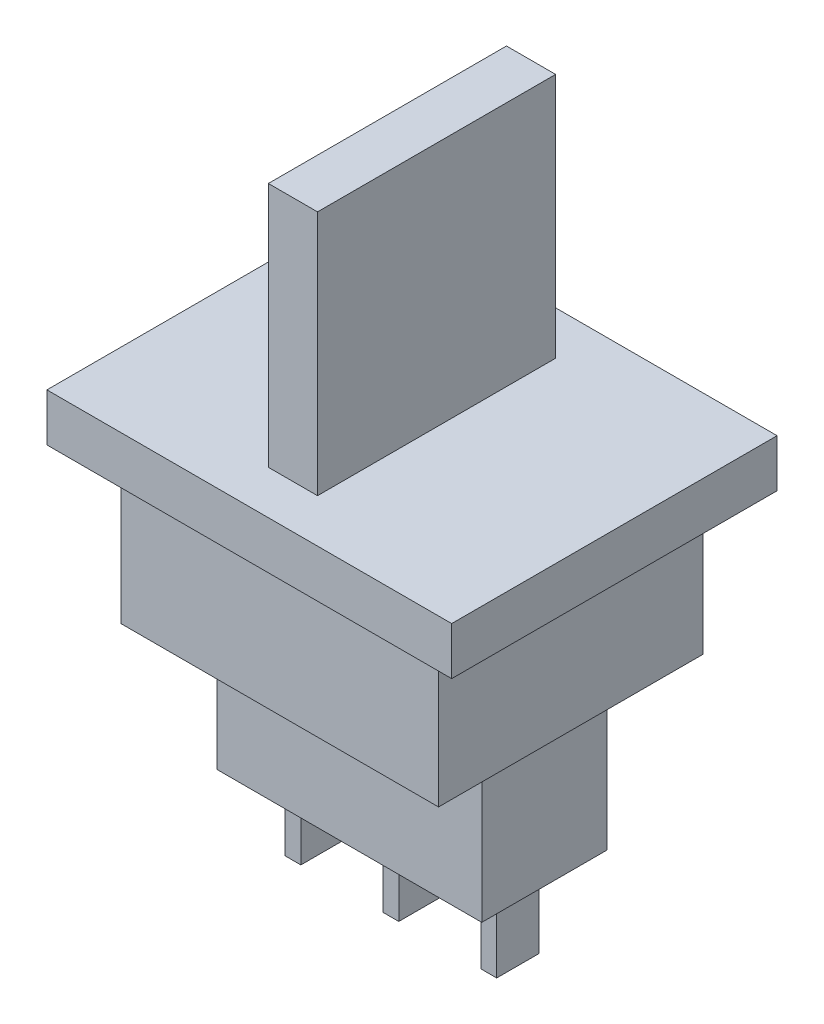
ISO-10303-21;
HEADER;
FILE_DESCRIPTION(('STEP AP214'),'2;1');
FILE_NAME('part.step','',(''),(''),'','','');
FILE_SCHEMA(('AUTOMOTIVE_DESIGN { 1 0 10303 214 1 1 1 1 }'));
ENDSEC;
DATA;
#1=APPLICATION_CONTEXT('core data for automotive mechanical design processes');
#2=APPLICATION_PROTOCOL_DEFINITION('international standard','automotive_design',2000,#1);
#3=PRODUCT_CONTEXT('',#1,'mechanical');
#4=PRODUCT('Part','Part','',(#3));
#5=PRODUCT_RELATED_PRODUCT_CATEGORY('part','',(#4));
#6=PRODUCT_DEFINITION_FORMATION('','',#4);
#7=PRODUCT_DEFINITION_CONTEXT('part definition',#1,'design');
#8=PRODUCT_DEFINITION('design','',#6,#7);
#9=PRODUCT_DEFINITION_SHAPE('','',#8);
#10=(LENGTH_UNIT() NAMED_UNIT(*) SI_UNIT(.MILLI.,.METRE.));
#11=(NAMED_UNIT(*) PLANE_ANGLE_UNIT() SI_UNIT($,.RADIAN.));
#12=(NAMED_UNIT(*) SI_UNIT($,.STERADIAN.) SOLID_ANGLE_UNIT());
#13=UNCERTAINTY_MEASURE_WITH_UNIT(LENGTH_MEASURE(1.E-05),#10,'distance_accuracy_value','');
#14=(GEOMETRIC_REPRESENTATION_CONTEXT(3) GLOBAL_UNCERTAINTY_ASSIGNED_CONTEXT((#13)) GLOBAL_UNIT_ASSIGNED_CONTEXT((#10,
#11,#12)) REPRESENTATION_CONTEXT('',''));
#15=CARTESIAN_POINT('',(0.,0.,0.));
#16=DIRECTION('',(0.,0.,1.));
#17=DIRECTION('',(1.,0.,0.));
#18=AXIS2_PLACEMENT_3D('',#15,#16,#17);
#19=CARTESIAN_POINT('',(0.,-14.22,0.));
#20=DIRECTION('',(0.,-1.,0.));
#21=DIRECTION('',(0.,0.,-1.));
#22=AXIS2_PLACEMENT_3D('',#19,#20,#21);
#23=PLANE('',#22);
#24=DIRECTION('',(0.,0.,1.));
#25=VECTOR('',#24,1.);
#26=CARTESIAN_POINT('',(6.35,-14.22,3.));
#27=LINE('',#26,#25);
#28=CARTESIAN_POINT('',(6.35,-14.22,-3.));
#29=VERTEX_POINT('',#28);
#30=CARTESIAN_POINT('',(6.35,-14.22,3.));
#31=VERTEX_POINT('',#30);
#32=EDGE_CURVE('E334',#29,#31,#27,.T.);
#33=ORIENTED_EDGE('',*,*,#32,.T.);
#34=DIRECTION('',(-1.,0.,0.));
#35=VECTOR('',#34,1.);
#36=CARTESIAN_POINT('',(-6.35,-14.22,3.));
#37=LINE('',#36,#35);
#38=CARTESIAN_POINT('',(-6.35,-14.22,3.));
#39=VERTEX_POINT('',#38);
#40=EDGE_CURVE('E337',#31,#39,#37,.T.);
#41=ORIENTED_EDGE('',*,*,#40,.T.);
#42=DIRECTION('',(0.,0.,-1.));
#43=VECTOR('',#42,1.);
#44=CARTESIAN_POINT('',(-6.35,-14.22,3.));
#45=LINE('',#44,#43);
#46=CARTESIAN_POINT('',(-6.35,-14.22,-3.));
#47=VERTEX_POINT('',#46);
#48=EDGE_CURVE('E340',#39,#47,#45,.T.);
#49=ORIENTED_EDGE('',*,*,#48,.T.);
#50=DIRECTION('',(1.,0.,0.));
#51=VECTOR('',#50,1.);
#52=CARTESIAN_POINT('',(-6.35,-14.22,-3.));
#53=LINE('',#52,#51);
#54=EDGE_CURVE('E342',#47,#29,#53,.T.);
#55=ORIENTED_EDGE('',*,*,#54,.T.);
#56=EDGE_LOOP('',(#33,#41,#49,#55));
#57=FACE_BOUND('',#56,.T.);
#58=DIRECTION('',(-1.,0.,0.));
#59=VECTOR('',#58,1.);
#60=CARTESIAN_POINT('',(-5.08,-14.22,1.015));
#61=LINE('',#60,#59);
#62=CARTESIAN_POINT('',(-4.32,-14.22,1.015));
#63=VERTEX_POINT('',#62);
#64=CARTESIAN_POINT('',(-5.08,-14.22,1.015));
#65=VERTEX_POINT('',#64);
#66=EDGE_CURVE('E318',#63,#65,#61,.T.);
#67=ORIENTED_EDGE('',*,*,#66,.F.);
#68=DIRECTION('',(0.,0.,1.));
#69=VECTOR('',#68,1.);
#70=CARTESIAN_POINT('',(-4.32,-14.22,1.015));
#71=LINE('',#70,#69);
#72=CARTESIAN_POINT('',(-4.32,-14.22,-1.015));
#73=VERTEX_POINT('',#72);
#74=EDGE_CURVE('E304',#73,#63,#71,.T.);
#75=ORIENTED_EDGE('',*,*,#74,.F.);
#76=DIRECTION('',(1.,0.,0.));
#77=VECTOR('',#76,1.);
#78=CARTESIAN_POINT('',(-5.08,-14.22,-1.015));
#79=LINE('',#78,#77);
#80=CARTESIAN_POINT('',(-5.08,-14.22,-1.015));
#81=VERTEX_POINT('',#80);
#82=EDGE_CURVE('E309',#81,#73,#79,.T.);
#83=ORIENTED_EDGE('',*,*,#82,.F.);
#84=DIRECTION('',(0.,0.,-1.));
#85=VECTOR('',#84,1.);
#86=CARTESIAN_POINT('',(-5.08,-14.22,1.015));
#87=LINE('',#86,#85);
#88=EDGE_CURVE('E320',#65,#81,#87,.T.);
#89=ORIENTED_EDGE('',*,*,#88,.F.);
#90=EDGE_LOOP('',(#67,#75,#83,#89));
#91=FACE_BOUND('',#90,.T.);
#92=DIRECTION('',(0.,0.,1.));
#93=VECTOR('',#92,1.);
#94=CARTESIAN_POINT('',(0.38,-14.22,1.015));
#95=LINE('',#94,#93);
#96=CARTESIAN_POINT('',(0.38,-14.22,-1.015));
#97=VERTEX_POINT('',#96);
#98=CARTESIAN_POINT('',(0.38,-14.22,1.015));
#99=VERTEX_POINT('',#98);
#100=EDGE_CURVE('E289',#97,#99,#95,.T.);
#101=ORIENTED_EDGE('',*,*,#100,.F.);
#102=DIRECTION('',(1.,0.,0.));
#103=VECTOR('',#102,1.);
#104=CARTESIAN_POINT('',(-0.38,-14.22,-1.015));
#105=LINE('',#104,#103);
#106=CARTESIAN_POINT('',(-0.38,-14.22,-1.015));
#107=VERTEX_POINT('',#106);
#108=EDGE_CURVE('E275',#107,#97,#105,.T.);
#109=ORIENTED_EDGE('',*,*,#108,.F.);
#110=DIRECTION('',(0.,0.,-1.));
#111=VECTOR('',#110,1.);
#112=CARTESIAN_POINT('',(-0.38,-14.22,1.015));
#113=LINE('',#112,#111);
#114=CARTESIAN_POINT('',(-0.38,-14.22,1.015));
#115=VERTEX_POINT('',#114);
#116=EDGE_CURVE('E280',#115,#107,#113,.T.);
#117=ORIENTED_EDGE('',*,*,#116,.F.);
#118=DIRECTION('',(-1.,0.,0.));
#119=VECTOR('',#118,1.);
#120=CARTESIAN_POINT('',(-0.38,-14.22,1.015));
#121=LINE('',#120,#119);
#122=EDGE_CURVE('E291',#99,#115,#121,.T.);
#123=ORIENTED_EDGE('',*,*,#122,.F.);
#124=EDGE_LOOP('',(#101,#109,#117,#123));
#125=FACE_BOUND('',#124,.T.);
#126=DIRECTION('',(0.,0.,1.));
#127=VECTOR('',#126,1.);
#128=CARTESIAN_POINT('',(5.08,-14.22,1.015));
#129=LINE('',#128,#127);
#130=CARTESIAN_POINT('',(5.08,-14.22,-1.015));
#131=VERTEX_POINT('',#130);
#132=CARTESIAN_POINT('',(5.08,-14.22,1.015));
#133=VERTEX_POINT('',#132);
#134=EDGE_CURVE('E260',#131,#133,#129,.T.);
#135=ORIENTED_EDGE('',*,*,#134,.F.);
#136=DIRECTION('',(1.,0.,0.));
#137=VECTOR('',#136,1.);
#138=CARTESIAN_POINT('',(4.32,-14.22,-1.015));
#139=LINE('',#138,#137);
#140=CARTESIAN_POINT('',(4.32,-14.22,-1.015));
#141=VERTEX_POINT('',#140);
#142=EDGE_CURVE('E245',#141,#131,#139,.T.);
#143=ORIENTED_EDGE('',*,*,#142,.F.);
#144=DIRECTION('',(0.,0.,-1.));
#145=VECTOR('',#144,1.);
#146=CARTESIAN_POINT('',(4.32,-14.22,1.015));
#147=LINE('',#146,#145);
#148=CARTESIAN_POINT('',(4.32,-14.22,1.015));
#149=VERTEX_POINT('',#148);
#150=EDGE_CURVE('E251',#149,#141,#147,.T.);
#151=ORIENTED_EDGE('',*,*,#150,.F.);
#152=DIRECTION('',(-1.,0.,0.));
#153=VECTOR('',#152,1.);
#154=CARTESIAN_POINT('',(4.32,-14.22,1.015));
#155=LINE('',#154,#153);
#156=EDGE_CURVE('E262',#133,#149,#155,.T.);
#157=ORIENTED_EDGE('',*,*,#156,.F.);
#158=EDGE_LOOP('',(#135,#143,#151,#157));
#159=FACE_BOUND('',#158,.T.);
#160=ADVANCED_FACE('F33',(#57,#91,#125,#159),#23,.T.);
#161=CARTESIAN_POINT('',(0.,-7.11,0.));
#162=DIRECTION('',(0.,1.,0.));
#163=DIRECTION('',(0.,0.,1.));
#164=AXIS2_PLACEMENT_3D('',#161,#162,#163);
#165=PLANE('',#164);
#166=DIRECTION('',(0.,0.,1.));
#167=VECTOR('',#166,1.);
#168=CARTESIAN_POINT('',(7.625,-7.11,-6.35));
#169=LINE('',#168,#167);
#170=CARTESIAN_POINT('',(7.625,-7.11,-6.35));
#171=VERTEX_POINT('',#170);
#172=CARTESIAN_POINT('',(7.625,-7.11,6.35));
#173=VERTEX_POINT('',#172);
#174=EDGE_CURVE('E367',#171,#173,#169,.T.);
#175=ORIENTED_EDGE('',*,*,#174,.T.);
#176=DIRECTION('',(-1.,0.,0.));
#177=VECTOR('',#176,1.);
#178=CARTESIAN_POINT('',(-7.625,-7.11,6.35));
#179=LINE('',#178,#177);
#180=CARTESIAN_POINT('',(-7.625,-7.11,6.35));
#181=VERTEX_POINT('',#180);
#182=EDGE_CURVE('E370',#173,#181,#179,.T.);
#183=ORIENTED_EDGE('',*,*,#182,.T.);
#184=DIRECTION('',(0.,0.,-1.));
#185=VECTOR('',#184,1.);
#186=CARTESIAN_POINT('',(-7.625,-7.11,-6.35));
#187=LINE('',#186,#185);
#188=CARTESIAN_POINT('',(-7.625,-7.11,-6.35));
#189=VERTEX_POINT('',#188);
#190=EDGE_CURVE('E373',#181,#189,#187,.T.);
#191=ORIENTED_EDGE('',*,*,#190,.T.);
#192=DIRECTION('',(1.,0.,0.));
#193=VECTOR('',#192,1.);
#194=CARTESIAN_POINT('',(-7.625,-7.11,-6.35));
#195=LINE('',#194,#193);
#196=EDGE_CURVE('E375',#189,#171,#195,.T.);
#197=ORIENTED_EDGE('',*,*,#196,.T.);
#198=EDGE_LOOP('',(#175,#183,#191,#197));
#199=FACE_BOUND('',#198,.T.);
#200=DIRECTION('',(0.,0.,1.));
#201=VECTOR('',#200,1.);
#202=CARTESIAN_POINT('',(6.35,-7.11,3.));
#203=LINE('',#202,#201);
#204=CARTESIAN_POINT('',(6.35,-7.11,-3.));
#205=VERTEX_POINT('',#204);
#206=CARTESIAN_POINT('',(6.35,-7.11,3.));
#207=VERTEX_POINT('',#206);
#208=EDGE_CURVE('E333',#205,#207,#203,.T.);
#209=ORIENTED_EDGE('',*,*,#208,.F.);
#210=DIRECTION('',(1.,0.,0.));
#211=VECTOR('',#210,1.);
#212=CARTESIAN_POINT('',(-6.35,-7.11,-3.));
#213=LINE('',#212,#211);
#214=CARTESIAN_POINT('',(-6.35,-7.11,-3.));
#215=VERTEX_POINT('',#214);
#216=EDGE_CURVE('E338',#215,#205,#213,.T.);
#217=ORIENTED_EDGE('',*,*,#216,.F.);
#218=DIRECTION('',(0.,0.,-1.));
#219=VECTOR('',#218,1.);
#220=CARTESIAN_POINT('',(-6.35,-7.11,3.));
#221=LINE('',#220,#219);
#222=CARTESIAN_POINT('',(-6.35,-7.11,3.));
#223=VERTEX_POINT('',#222);
#224=EDGE_CURVE('E350',#223,#215,#221,.T.);
#225=ORIENTED_EDGE('',*,*,#224,.F.);
#226=DIRECTION('',(-1.,0.,0.));
#227=VECTOR('',#226,1.);
#228=CARTESIAN_POINT('',(-6.35,-7.11,3.));
#229=LINE('',#228,#227);
#230=EDGE_CURVE('E347',#207,#223,#229,.T.);
#231=ORIENTED_EDGE('',*,*,#230,.F.);
#232=EDGE_LOOP('',(#209,#217,#225,#231));
#233=FACE_BOUND('',#232,.T.);
#234=ADVANCED_FACE('F450',(#199,#233),#165,.F.);
#235=CARTESIAN_POINT('',(9.715,2.29,7.81));
#236=DIRECTION('',(-1.,0.,0.));
#237=DIRECTION('',(0.,0.,1.));
#238=AXIS2_PLACEMENT_3D('',#235,#236,#237);
#239=PLANE('',#238);
#240=DIRECTION('',(0.,0.,-1.));
#241=VECTOR('',#240,1.);
#242=CARTESIAN_POINT('',(9.715,0.,7.81));
#243=LINE('',#242,#241);
#244=CARTESIAN_POINT('',(9.715,0.,7.81));
#245=VERTEX_POINT('',#244);
#246=CARTESIAN_POINT('',(9.715,0.,-7.81));
#247=VERTEX_POINT('',#246);
#248=EDGE_CURVE('E399',#245,#247,#243,.T.);
#249=ORIENTED_EDGE('',*,*,#248,.T.);
#250=DIRECTION('',(0.,-1.,0.));
#251=VECTOR('',#250,1.);
#252=CARTESIAN_POINT('',(9.715,2.29,-7.81));
#253=LINE('',#252,#251);
#254=CARTESIAN_POINT('',(9.715,2.29,-7.81));
#255=VERTEX_POINT('',#254);
#256=EDGE_CURVE('E426',#255,#247,#253,.T.);
#257=ORIENTED_EDGE('',*,*,#256,.F.);
#258=DIRECTION('',(0.,0.,-1.));
#259=VECTOR('',#258,1.);
#260=CARTESIAN_POINT('',(9.715,2.29,7.81));
#261=LINE('',#260,#259);
#262=CARTESIAN_POINT('',(9.715,2.29,7.81));
#263=VERTEX_POINT('',#262);
#264=EDGE_CURVE('E400',#263,#255,#261,.T.);
#265=ORIENTED_EDGE('',*,*,#264,.F.);
#266=DIRECTION('',(0.,-1.,0.));
#267=VECTOR('',#266,1.);
#268=CARTESIAN_POINT('',(9.715,2.29,7.81));
#269=LINE('',#268,#267);
#270=EDGE_CURVE('E410',#263,#245,#269,.T.);
#271=ORIENTED_EDGE('',*,*,#270,.T.);
#272=EDGE_LOOP('',(#249,#257,#265,#271));
#273=FACE_BOUND('',#272,.T.);
#274=ADVANCED_FACE('F35',(#273),#239,.F.);
#275=CARTESIAN_POINT('',(-9.715,2.29,-7.81));
#276=DIRECTION('',(0.,0.,1.));
#277=DIRECTION('',(1.,0.,0.));
#278=AXIS2_PLACEMENT_3D('',#275,#276,#277);
#279=PLANE('',#278);
#280=DIRECTION('',(-1.,0.,0.));
#281=VECTOR('',#280,1.);
#282=CARTESIAN_POINT('',(-9.715,0.,-7.81));
#283=LINE('',#282,#281);
#284=CARTESIAN_POINT('',(-9.715,0.,-7.81));
#285=VERTEX_POINT('',#284);
#286=EDGE_CURVE('E413',#247,#285,#283,.T.);
#287=ORIENTED_EDGE('',*,*,#286,.T.);
#288=DIRECTION('',(0.,-1.,0.));
#289=VECTOR('',#288,1.);
#290=CARTESIAN_POINT('',(-9.715,2.29,-7.81));
#291=LINE('',#290,#289);
#292=CARTESIAN_POINT('',(-9.715,2.29,-7.81));
#293=VERTEX_POINT('',#292);
#294=EDGE_CURVE('E423',#293,#285,#291,.T.);
#295=ORIENTED_EDGE('',*,*,#294,.F.);
#296=DIRECTION('',(-1.,0.,0.));
#297=VECTOR('',#296,1.);
#298=CARTESIAN_POINT('',(-9.715,2.29,-7.81));
#299=LINE('',#298,#297);
#300=EDGE_CURVE('E403',#255,#293,#299,.T.);
#301=ORIENTED_EDGE('',*,*,#300,.F.);
#302=ORIENTED_EDGE('',*,*,#256,.T.);
#303=EDGE_LOOP('',(#287,#295,#301,#302));
#304=FACE_BOUND('',#303,.T.);
#305=ADVANCED_FACE('F507',(#304),#279,.F.);
#306=CARTESIAN_POINT('',(-9.715,2.29,7.81));
#307=DIRECTION('',(1.,0.,0.));
#308=DIRECTION('',(0.,0.,-1.));
#309=AXIS2_PLACEMENT_3D('',#306,#307,#308);
#310=PLANE('',#309);
#311=DIRECTION('',(0.,0.,1.));
#312=VECTOR('',#311,1.);
#313=CARTESIAN_POINT('',(-9.715,0.,7.81));
#314=LINE('',#313,#312);
#315=CARTESIAN_POINT('',(-9.715,0.,7.81));
#316=VERTEX_POINT('',#315);
#317=EDGE_CURVE('E415',#285,#316,#314,.T.);
#318=ORIENTED_EDGE('',*,*,#317,.T.);
#319=DIRECTION('',(0.,-1.,0.));
#320=VECTOR('',#319,1.);
#321=CARTESIAN_POINT('',(-9.715,2.29,7.81));
#322=LINE('',#321,#320);
#323=CARTESIAN_POINT('',(-9.715,2.29,7.81));
#324=VERTEX_POINT('',#323);
#325=EDGE_CURVE('E420',#324,#316,#322,.T.);
#326=ORIENTED_EDGE('',*,*,#325,.F.);
#327=DIRECTION('',(0.,0.,1.));
#328=VECTOR('',#327,1.);
#329=CARTESIAN_POINT('',(-9.715,2.29,7.81));
#330=LINE('',#329,#328);
#331=EDGE_CURVE('E406',#293,#324,#330,.T.);
#332=ORIENTED_EDGE('',*,*,#331,.F.);
#333=ORIENTED_EDGE('',*,*,#294,.T.);
#334=EDGE_LOOP('',(#318,#326,#332,#333));
#335=FACE_BOUND('',#334,.T.);
#336=ADVANCED_FACE('F504',(#335),#310,.F.);
#337=CARTESIAN_POINT('',(-9.715,2.29,7.81));
#338=DIRECTION('',(0.,0.,-1.));
#339=DIRECTION('',(-1.,0.,0.));
#340=AXIS2_PLACEMENT_3D('',#337,#338,#339);
#341=PLANE('',#340);
#342=DIRECTION('',(1.,0.,0.));
#343=VECTOR('',#342,1.);
#344=CARTESIAN_POINT('',(-9.715,0.,7.81));
#345=LINE('',#344,#343);
#346=EDGE_CURVE('E404',#316,#245,#345,.T.);
#347=ORIENTED_EDGE('',*,*,#346,.T.);
#348=ORIENTED_EDGE('',*,*,#270,.F.);
#349=DIRECTION('',(1.,0.,0.));
#350=VECTOR('',#349,1.);
#351=CARTESIAN_POINT('',(-9.715,2.29,7.81));
#352=LINE('',#351,#350);
#353=EDGE_CURVE('E408',#324,#263,#352,.T.);
#354=ORIENTED_EDGE('',*,*,#353,.F.);
#355=ORIENTED_EDGE('',*,*,#325,.T.);
#356=EDGE_LOOP('',(#347,#348,#354,#355));
#357=FACE_BOUND('',#356,.T.);
#358=ADVANCED_FACE('F498',(#357),#341,.F.);
#359=CARTESIAN_POINT('',(0.,2.29,0.));
#360=DIRECTION('',(0.,-1.,0.));
#361=DIRECTION('',(0.,0.,-1.));
#362=AXIS2_PLACEMENT_3D('',#359,#360,#361);
#363=PLANE('',#362);
#364=DIRECTION('',(0.,0.,-1.));
#365=VECTOR('',#364,1.);
#366=CARTESIAN_POINT('',(-1.18000000000002,2.29,0.));
#367=LINE('',#366,#365);
#368=CARTESIAN_POINT('',(-1.18000000000007,2.29,5.715));
#369=VERTEX_POINT('',#368);
#370=CARTESIAN_POINT('',(-1.18000000000002,2.29,-5.715));
#371=VERTEX_POINT('',#370);
#372=EDGE_CURVE('E41',#369,#371,#367,.T.);
#373=ORIENTED_EDGE('',*,*,#372,.T.);
#374=DIRECTION('',(1.,0.,0.));
#375=VECTOR('',#374,1.);
#376=CARTESIAN_POINT('',(0.,2.29,-5.715));
#377=LINE('',#376,#375);
#378=CARTESIAN_POINT('',(1.17999999999998,2.29,-5.715));
#379=VERTEX_POINT('',#378);
#380=EDGE_CURVE('E11',#371,#379,#377,.T.);
#381=ORIENTED_EDGE('',*,*,#380,.T.);
#382=DIRECTION('',(0.,0.,1.));
#383=VECTOR('',#382,1.);
#384=CARTESIAN_POINT('',(1.17999999999998,2.29,0.));
#385=LINE('',#384,#383);
#386=CARTESIAN_POINT('',(1.17999999999998,2.29,5.715));
#387=VERTEX_POINT('',#386);
#388=EDGE_CURVE('E430',#379,#387,#385,.T.);
#389=ORIENTED_EDGE('',*,*,#388,.T.);
#390=DIRECTION('',(1.,0.,0.));
#391=VECTOR('',#390,1.);
#392=CARTESIAN_POINT('',(0.,2.29,5.715));
#393=LINE('',#392,#391);
#394=EDGE_CURVE('E221',#369,#387,#393,.T.);
#395=ORIENTED_EDGE('',*,*,#394,.F.);
#396=EDGE_LOOP('',(#373,#381,#389,#395));
#397=FACE_BOUND('',#396,.T.);
#398=ORIENTED_EDGE('',*,*,#264,.T.);
#399=ORIENTED_EDGE('',*,*,#300,.T.);
#400=ORIENTED_EDGE('',*,*,#331,.T.);
#401=ORIENTED_EDGE('',*,*,#353,.T.);
#402=EDGE_LOOP('',(#398,#399,#400,#401));
#403=FACE_BOUND('',#402,.T.);
#404=ADVANCED_FACE('F431',(#397,#403),#363,.F.);
#405=CARTESIAN_POINT('',(0.,0.,0.));
#406=DIRECTION('',(0.,-1.,0.));
#407=DIRECTION('',(0.,0.,-1.));
#408=AXIS2_PLACEMENT_3D('',#405,#406,#407);
#409=PLANE('',#408);
#410=DIRECTION('',(0.,0.,1.));
#411=VECTOR('',#410,1.);
#412=CARTESIAN_POINT('',(7.625,0.,-6.35));
#413=LINE('',#412,#411);
#414=CARTESIAN_POINT('',(7.625,0.,-6.35));
#415=VERTEX_POINT('',#414);
#416=CARTESIAN_POINT('',(7.625,0.,6.35));
#417=VERTEX_POINT('',#416);
#418=EDGE_CURVE('E366',#415,#417,#413,.T.);
#419=ORIENTED_EDGE('',*,*,#418,.F.);
#420=DIRECTION('',(1.,0.,0.));
#421=VECTOR('',#420,1.);
#422=CARTESIAN_POINT('',(-7.625,0.,-6.35));
#423=LINE('',#422,#421);
#424=CARTESIAN_POINT('',(-7.625,0.,-6.35));
#425=VERTEX_POINT('',#424);
#426=EDGE_CURVE('E371',#425,#415,#423,.T.);
#427=ORIENTED_EDGE('',*,*,#426,.F.);
#428=DIRECTION('',(0.,0.,-1.));
#429=VECTOR('',#428,1.);
#430=CARTESIAN_POINT('',(-7.625,0.,-6.35));
#431=LINE('',#430,#429);
#432=CARTESIAN_POINT('',(-7.625,0.,6.35));
#433=VERTEX_POINT('',#432);
#434=EDGE_CURVE('E383',#433,#425,#431,.T.);
#435=ORIENTED_EDGE('',*,*,#434,.F.);
#436=DIRECTION('',(-1.,0.,0.));
#437=VECTOR('',#436,1.);
#438=CARTESIAN_POINT('',(-7.625,0.,6.35));
#439=LINE('',#438,#437);
#440=EDGE_CURVE('E380',#417,#433,#439,.T.);
#441=ORIENTED_EDGE('',*,*,#440,.F.);
#442=EDGE_LOOP('',(#419,#427,#435,#441));
#443=FACE_BOUND('',#442,.T.);
#444=ORIENTED_EDGE('',*,*,#248,.F.);
#445=ORIENTED_EDGE('',*,*,#346,.F.);
#446=ORIENTED_EDGE('',*,*,#317,.F.);
#447=ORIENTED_EDGE('',*,*,#286,.F.);
#448=EDGE_LOOP('',(#444,#445,#446,#447));
#449=FACE_BOUND('',#448,.T.);
#450=ADVANCED_FACE('F494',(#443,#449),#409,.T.);
#451=CARTESIAN_POINT('',(7.625,-7.11,-6.35));
#452=DIRECTION('',(-1.,0.,0.));
#453=DIRECTION('',(0.,0.,1.));
#454=AXIS2_PLACEMENT_3D('',#451,#452,#453);
#455=PLANE('',#454);
#456=ORIENTED_EDGE('',*,*,#418,.T.);
#457=DIRECTION('',(0.,1.,0.));
#458=VECTOR('',#457,1.);
#459=CARTESIAN_POINT('',(7.625,-7.11,6.35));
#460=LINE('',#459,#458);
#461=EDGE_CURVE('E396',#173,#417,#460,.T.);
#462=ORIENTED_EDGE('',*,*,#461,.F.);
#463=ORIENTED_EDGE('',*,*,#174,.F.);
#464=DIRECTION('',(0.,1.,0.));
#465=VECTOR('',#464,1.);
#466=CARTESIAN_POINT('',(7.625,-7.11,-6.35));
#467=LINE('',#466,#465);
#468=EDGE_CURVE('E377',#171,#415,#467,.T.);
#469=ORIENTED_EDGE('',*,*,#468,.T.);
#470=EDGE_LOOP('',(#456,#462,#463,#469));
#471=FACE_BOUND('',#470,.T.);
#472=ADVANCED_FACE('F490',(#471),#455,.F.);
#473=CARTESIAN_POINT('',(-7.625,-7.11,6.35));
#474=DIRECTION('',(0.,0.,-1.));
#475=DIRECTION('',(-1.,0.,0.));
#476=AXIS2_PLACEMENT_3D('',#473,#474,#475);
#477=PLANE('',#476);
#478=ORIENTED_EDGE('',*,*,#440,.T.);
#479=DIRECTION('',(0.,1.,0.));
#480=VECTOR('',#479,1.);
#481=CARTESIAN_POINT('',(-7.625,-7.11,6.35));
#482=LINE('',#481,#480);
#483=EDGE_CURVE('E393',#181,#433,#482,.T.);
#484=ORIENTED_EDGE('',*,*,#483,.F.);
#485=ORIENTED_EDGE('',*,*,#182,.F.);
#486=ORIENTED_EDGE('',*,*,#461,.T.);
#487=EDGE_LOOP('',(#478,#484,#485,#486));
#488=FACE_BOUND('',#487,.T.);
#489=ADVANCED_FACE('F486',(#488),#477,.F.);
#490=CARTESIAN_POINT('',(-7.625,-7.11,-6.35));
#491=DIRECTION('',(1.,0.,0.));
#492=DIRECTION('',(0.,0.,-1.));
#493=AXIS2_PLACEMENT_3D('',#490,#491,#492);
#494=PLANE('',#493);
#495=ORIENTED_EDGE('',*,*,#434,.T.);
#496=DIRECTION('',(0.,1.,0.));
#497=VECTOR('',#496,1.);
#498=CARTESIAN_POINT('',(-7.625,-7.11,-6.35));
#499=LINE('',#498,#497);
#500=EDGE_CURVE('E390',#189,#425,#499,.T.);
#501=ORIENTED_EDGE('',*,*,#500,.F.);
#502=ORIENTED_EDGE('',*,*,#190,.F.);
#503=ORIENTED_EDGE('',*,*,#483,.T.);
#504=EDGE_LOOP('',(#495,#501,#502,#503));
#505=FACE_BOUND('',#504,.T.);
#506=ADVANCED_FACE('F482',(#505),#494,.F.);
#507=CARTESIAN_POINT('',(-7.625,-7.11,-6.35));
#508=DIRECTION('',(0.,0.,1.));
#509=DIRECTION('',(1.,0.,0.));
#510=AXIS2_PLACEMENT_3D('',#507,#508,#509);
#511=PLANE('',#510);
#512=ORIENTED_EDGE('',*,*,#426,.T.);
#513=ORIENTED_EDGE('',*,*,#468,.F.);
#514=ORIENTED_EDGE('',*,*,#196,.F.);
#515=ORIENTED_EDGE('',*,*,#500,.T.);
#516=EDGE_LOOP('',(#512,#513,#514,#515));
#517=FACE_BOUND('',#516,.T.);
#518=ADVANCED_FACE('F477',(#517),#511,.F.);
#519=CARTESIAN_POINT('',(6.35,-14.22,3.));
#520=DIRECTION('',(-1.,0.,0.));
#521=DIRECTION('',(0.,0.,1.));
#522=AXIS2_PLACEMENT_3D('',#519,#520,#521);
#523=PLANE('',#522);
#524=ORIENTED_EDGE('',*,*,#208,.T.);
#525=DIRECTION('',(0.,1.,0.));
#526=VECTOR('',#525,1.);
#527=CARTESIAN_POINT('',(6.35,-14.22,3.));
#528=LINE('',#527,#526);
#529=EDGE_CURVE('E363',#31,#207,#528,.T.);
#530=ORIENTED_EDGE('',*,*,#529,.F.);
#531=ORIENTED_EDGE('',*,*,#32,.F.);
#532=DIRECTION('',(0.,1.,0.));
#533=VECTOR('',#532,1.);
#534=CARTESIAN_POINT('',(6.35,-14.22,-3.));
#535=LINE('',#534,#533);
#536=EDGE_CURVE('E344',#29,#205,#535,.T.);
#537=ORIENTED_EDGE('',*,*,#536,.T.);
#538=EDGE_LOOP('',(#524,#530,#531,#537));
#539=FACE_BOUND('',#538,.T.);
#540=ADVANCED_FACE('F474',(#539),#523,.F.);
#541=CARTESIAN_POINT('',(-6.35,-14.22,3.));
#542=DIRECTION('',(0.,0.,-1.));
#543=DIRECTION('',(-1.,0.,0.));
#544=AXIS2_PLACEMENT_3D('',#541,#542,#543);
#545=PLANE('',#544);
#546=ORIENTED_EDGE('',*,*,#230,.T.);
#547=DIRECTION('',(0.,1.,0.));
#548=VECTOR('',#547,1.);
#549=CARTESIAN_POINT('',(-6.35,-14.22,3.));
#550=LINE('',#549,#548);
#551=EDGE_CURVE('E360',#39,#223,#550,.T.);
#552=ORIENTED_EDGE('',*,*,#551,.F.);
#553=ORIENTED_EDGE('',*,*,#40,.F.);
#554=ORIENTED_EDGE('',*,*,#529,.T.);
#555=EDGE_LOOP('',(#546,#552,#553,#554));
#556=FACE_BOUND('',#555,.T.);
#557=ADVANCED_FACE('F470',(#556),#545,.F.);
#558=CARTESIAN_POINT('',(-6.35,-14.22,3.));
#559=DIRECTION('',(1.,0.,0.));
#560=DIRECTION('',(0.,0.,-1.));
#561=AXIS2_PLACEMENT_3D('',#558,#559,#560);
#562=PLANE('',#561);
#563=ORIENTED_EDGE('',*,*,#224,.T.);
#564=DIRECTION('',(0.,1.,0.));
#565=VECTOR('',#564,1.);
#566=CARTESIAN_POINT('',(-6.35,-14.22,-3.));
#567=LINE('',#566,#565);
#568=EDGE_CURVE('E357',#47,#215,#567,.T.);
#569=ORIENTED_EDGE('',*,*,#568,.F.);
#570=ORIENTED_EDGE('',*,*,#48,.F.);
#571=ORIENTED_EDGE('',*,*,#551,.T.);
#572=EDGE_LOOP('',(#563,#569,#570,#571));
#573=FACE_BOUND('',#572,.T.);
#574=ADVANCED_FACE('F466',(#573),#562,.F.);
#575=CARTESIAN_POINT('',(-6.35,-14.22,-3.));
#576=DIRECTION('',(0.,0.,1.));
#577=DIRECTION('',(1.,0.,0.));
#578=AXIS2_PLACEMENT_3D('',#575,#576,#577);
#579=PLANE('',#578);
#580=ORIENTED_EDGE('',*,*,#216,.T.);
#581=ORIENTED_EDGE('',*,*,#536,.F.);
#582=ORIENTED_EDGE('',*,*,#54,.F.);
#583=ORIENTED_EDGE('',*,*,#568,.T.);
#584=EDGE_LOOP('',(#580,#581,#582,#583));
#585=FACE_BOUND('',#584,.T.);
#586=ADVANCED_FACE('F463',(#585),#579,.F.);
#587=CARTESIAN_POINT('',(-4.32,-18.16,1.015));
#588=DIRECTION('',(-1.,0.,0.));
#589=DIRECTION('',(0.,0.,1.));
#590=AXIS2_PLACEMENT_3D('',#587,#588,#589);
#591=PLANE('',#590);
#592=ORIENTED_EDGE('',*,*,#74,.T.);
#593=DIRECTION('',(0.,1.,0.));
#594=VECTOR('',#593,1.);
#595=CARTESIAN_POINT('',(-4.32,-18.16,1.015));
#596=LINE('',#595,#594);
#597=CARTESIAN_POINT('',(-4.32,-18.16,1.015));
#598=VERTEX_POINT('',#597);
#599=EDGE_CURVE('E331',#598,#63,#596,.T.);
#600=ORIENTED_EDGE('',*,*,#599,.F.);
#601=DIRECTION('',(0.,0.,1.));
#602=VECTOR('',#601,1.);
#603=CARTESIAN_POINT('',(-4.32,-18.16,1.015));
#604=LINE('',#603,#602);
#605=CARTESIAN_POINT('',(-4.32,-18.16,-1.015));
#606=VERTEX_POINT('',#605);
#607=EDGE_CURVE('E305',#606,#598,#604,.T.);
#608=ORIENTED_EDGE('',*,*,#607,.F.);
#609=DIRECTION('',(0.,1.,0.));
#610=VECTOR('',#609,1.);
#611=CARTESIAN_POINT('',(-4.32,-18.16,-1.015));
#612=LINE('',#611,#610);
#613=EDGE_CURVE('E315',#606,#73,#612,.T.);
#614=ORIENTED_EDGE('',*,*,#613,.T.);
#615=EDGE_LOOP('',(#592,#600,#608,#614));
#616=FACE_BOUND('',#615,.T.);
#617=ADVANCED_FACE('F461',(#616),#591,.F.);
#618=CARTESIAN_POINT('',(-5.08,-18.16,1.015));
#619=DIRECTION('',(0.,0.,-1.));
#620=DIRECTION('',(-1.,0.,0.));
#621=AXIS2_PLACEMENT_3D('',#618,#619,#620);
#622=PLANE('',#621);
#623=ORIENTED_EDGE('',*,*,#66,.T.);
#624=DIRECTION('',(0.,1.,0.));
#625=VECTOR('',#624,1.);
#626=CARTESIAN_POINT('',(-5.08,-18.16,1.015));
#627=LINE('',#626,#625);
#628=CARTESIAN_POINT('',(-5.08,-18.16,1.015));
#629=VERTEX_POINT('',#628);
#630=EDGE_CURVE('E328',#629,#65,#627,.T.);
#631=ORIENTED_EDGE('',*,*,#630,.F.);
#632=DIRECTION('',(-1.,0.,0.));
#633=VECTOR('',#632,1.);
#634=CARTESIAN_POINT('',(-5.08,-18.16,1.015));
#635=LINE('',#634,#633);
#636=EDGE_CURVE('E308',#598,#629,#635,.T.);
#637=ORIENTED_EDGE('',*,*,#636,.F.);
#638=ORIENTED_EDGE('',*,*,#599,.T.);
#639=EDGE_LOOP('',(#623,#631,#637,#638));
#640=FACE_BOUND('',#639,.T.);
#641=ADVANCED_FACE('F573',(#640),#622,.F.);
#642=CARTESIAN_POINT('',(-5.08,-18.16,1.015));
#643=DIRECTION('',(1.,0.,0.));
#644=DIRECTION('',(0.,0.,-1.));
#645=AXIS2_PLACEMENT_3D('',#642,#643,#644);
#646=PLANE('',#645);
#647=ORIENTED_EDGE('',*,*,#88,.T.);
#648=DIRECTION('',(0.,1.,0.));
#649=VECTOR('',#648,1.);
#650=CARTESIAN_POINT('',(-5.08,-18.16,-1.015));
#651=LINE('',#650,#649);
#652=CARTESIAN_POINT('',(-5.08,-18.16,-1.015));
#653=VERTEX_POINT('',#652);
#654=EDGE_CURVE('E326',#653,#81,#651,.T.);
#655=ORIENTED_EDGE('',*,*,#654,.F.);
#656=DIRECTION('',(0.,0.,-1.));
#657=VECTOR('',#656,1.);
#658=CARTESIAN_POINT('',(-5.08,-18.16,1.015));
#659=LINE('',#658,#657);
#660=EDGE_CURVE('E311',#629,#653,#659,.T.);
#661=ORIENTED_EDGE('',*,*,#660,.F.);
#662=ORIENTED_EDGE('',*,*,#630,.T.);
#663=EDGE_LOOP('',(#647,#655,#661,#662));
#664=FACE_BOUND('',#663,.T.);
#665=ADVANCED_FACE('F582',(#664),#646,.F.);
#666=CARTESIAN_POINT('',(-5.08,-18.16,-1.015));
#667=DIRECTION('',(0.,0.,1.));
#668=DIRECTION('',(1.,0.,0.));
#669=AXIS2_PLACEMENT_3D('',#666,#667,#668);
#670=PLANE('',#669);
#671=ORIENTED_EDGE('',*,*,#82,.T.);
#672=ORIENTED_EDGE('',*,*,#613,.F.);
#673=DIRECTION('',(1.,0.,0.));
#674=VECTOR('',#673,1.);
#675=CARTESIAN_POINT('',(-5.08,-18.16,-1.015));
#676=LINE('',#675,#674);
#677=EDGE_CURVE('E313',#653,#606,#676,.T.);
#678=ORIENTED_EDGE('',*,*,#677,.F.);
#679=ORIENTED_EDGE('',*,*,#654,.T.);
#680=EDGE_LOOP('',(#671,#672,#678,#679));
#681=FACE_BOUND('',#680,.T.);
#682=ADVANCED_FACE('F591',(#681),#670,.F.);
#683=CARTESIAN_POINT('',(0.,-18.16,0.));
#684=DIRECTION('',(0.,-1.,0.));
#685=DIRECTION('',(0.,0.,-1.));
#686=AXIS2_PLACEMENT_3D('',#683,#684,#685);
#687=PLANE('',#686);
#688=ORIENTED_EDGE('',*,*,#607,.T.);
#689=ORIENTED_EDGE('',*,*,#636,.T.);
#690=ORIENTED_EDGE('',*,*,#660,.T.);
#691=ORIENTED_EDGE('',*,*,#677,.T.);
#692=EDGE_LOOP('',(#688,#689,#690,#691));
#693=FACE_BOUND('',#692,.T.);
#694=ADVANCED_FACE('F601',(#693),#687,.T.);
#695=CARTESIAN_POINT('',(-0.38,-18.16,-1.015));
#696=DIRECTION('',(0.,0.,1.));
#697=DIRECTION('',(1.,0.,0.));
#698=AXIS2_PLACEMENT_3D('',#695,#696,#697);
#699=PLANE('',#698);
#700=ORIENTED_EDGE('',*,*,#108,.T.);
#701=DIRECTION('',(0.,1.,0.));
#702=VECTOR('',#701,1.);
#703=CARTESIAN_POINT('',(0.38,-18.16,-1.015));
#704=LINE('',#703,#702);
#705=CARTESIAN_POINT('',(0.38,-18.16,-1.015));
#706=VERTEX_POINT('',#705);
#707=EDGE_CURVE('E302',#706,#97,#704,.T.);
#708=ORIENTED_EDGE('',*,*,#707,.F.);
#709=DIRECTION('',(1.,0.,0.));
#710=VECTOR('',#709,1.);
#711=CARTESIAN_POINT('',(-0.38,-18.16,-1.015));
#712=LINE('',#711,#710);
#713=CARTESIAN_POINT('',(-0.38,-18.16,-1.015));
#714=VERTEX_POINT('',#713);
#715=EDGE_CURVE('E276',#714,#706,#712,.T.);
#716=ORIENTED_EDGE('',*,*,#715,.F.);
#717=DIRECTION('',(0.,1.,0.));
#718=VECTOR('',#717,1.);
#719=CARTESIAN_POINT('',(-0.38,-18.16,-1.015));
#720=LINE('',#719,#718);
#721=EDGE_CURVE('E286',#714,#107,#720,.T.);
#722=ORIENTED_EDGE('',*,*,#721,.T.);
#723=EDGE_LOOP('',(#700,#708,#716,#722));
#724=FACE_BOUND('',#723,.T.);
#725=ADVANCED_FACE('F611',(#724),#699,.F.);
#726=CARTESIAN_POINT('',(0.38,-18.16,1.015));
#727=DIRECTION('',(-1.,0.,0.));
#728=DIRECTION('',(0.,0.,1.));
#729=AXIS2_PLACEMENT_3D('',#726,#727,#728);
#730=PLANE('',#729);
#731=ORIENTED_EDGE('',*,*,#100,.T.);
#732=DIRECTION('',(0.,1.,0.));
#733=VECTOR('',#732,1.);
#734=CARTESIAN_POINT('',(0.38,-18.16,1.015));
#735=LINE('',#734,#733);
#736=CARTESIAN_POINT('',(0.38,-18.16,1.015));
#737=VERTEX_POINT('',#736);
#738=EDGE_CURVE('E299',#737,#99,#735,.T.);
#739=ORIENTED_EDGE('',*,*,#738,.F.);
#740=DIRECTION('',(0.,0.,1.));
#741=VECTOR('',#740,1.);
#742=CARTESIAN_POINT('',(0.38,-18.16,1.015));
#743=LINE('',#742,#741);
#744=EDGE_CURVE('E279',#706,#737,#743,.T.);
#745=ORIENTED_EDGE('',*,*,#744,.F.);
#746=ORIENTED_EDGE('',*,*,#707,.T.);
#747=EDGE_LOOP('',(#731,#739,#745,#746));
#748=FACE_BOUND('',#747,.T.);
#749=ADVANCED_FACE('F621',(#748),#730,.F.);
#750=CARTESIAN_POINT('',(-0.38,-18.16,1.015));
#751=DIRECTION('',(0.,0.,-1.));
#752=DIRECTION('',(-1.,0.,0.));
#753=AXIS2_PLACEMENT_3D('',#750,#751,#752);
#754=PLANE('',#753);
#755=ORIENTED_EDGE('',*,*,#122,.T.);
#756=DIRECTION('',(0.,1.,0.));
#757=VECTOR('',#756,1.);
#758=CARTESIAN_POINT('',(-0.38,-18.16,1.015));
#759=LINE('',#758,#757);
#760=CARTESIAN_POINT('',(-0.38,-18.16,1.015));
#761=VERTEX_POINT('',#760);
#762=EDGE_CURVE('E297',#761,#115,#759,.T.);
#763=ORIENTED_EDGE('',*,*,#762,.F.);
#764=DIRECTION('',(-1.,0.,0.));
#765=VECTOR('',#764,1.);
#766=CARTESIAN_POINT('',(-0.38,-18.16,1.015));
#767=LINE('',#766,#765);
#768=EDGE_CURVE('E282',#737,#761,#767,.T.);
#769=ORIENTED_EDGE('',*,*,#768,.F.);
#770=ORIENTED_EDGE('',*,*,#738,.T.);
#771=EDGE_LOOP('',(#755,#763,#769,#770));
#772=FACE_BOUND('',#771,.T.);
#773=ADVANCED_FACE('F631',(#772),#754,.F.);
#774=CARTESIAN_POINT('',(-0.38,-18.16,1.015));
#775=DIRECTION('',(1.,0.,0.));
#776=DIRECTION('',(0.,0.,-1.));
#777=AXIS2_PLACEMENT_3D('',#774,#775,#776);
#778=PLANE('',#777);
#779=ORIENTED_EDGE('',*,*,#116,.T.);
#780=ORIENTED_EDGE('',*,*,#721,.F.);
#781=DIRECTION('',(0.,0.,-1.));
#782=VECTOR('',#781,1.);
#783=CARTESIAN_POINT('',(-0.38,-18.16,1.015));
#784=LINE('',#783,#782);
#785=EDGE_CURVE('E284',#761,#714,#784,.T.);
#786=ORIENTED_EDGE('',*,*,#785,.F.);
#787=ORIENTED_EDGE('',*,*,#762,.T.);
#788=EDGE_LOOP('',(#779,#780,#786,#787));
#789=FACE_BOUND('',#788,.T.);
#790=ADVANCED_FACE('F641',(#789),#778,.F.);
#791=CARTESIAN_POINT('',(0.,-18.16,0.));
#792=DIRECTION('',(0.,1.,0.));
#793=DIRECTION('',(0.,0.,1.));
#794=AXIS2_PLACEMENT_3D('',#791,#792,#793);
#795=PLANE('',#794);
#796=ORIENTED_EDGE('',*,*,#715,.T.);
#797=ORIENTED_EDGE('',*,*,#744,.T.);
#798=ORIENTED_EDGE('',*,*,#768,.T.);
#799=ORIENTED_EDGE('',*,*,#785,.T.);
#800=EDGE_LOOP('',(#796,#797,#798,#799));
#801=FACE_BOUND('',#800,.T.);
#802=ADVANCED_FACE('F651',(#801),#795,.F.);
#803=CARTESIAN_POINT('',(4.32,-18.16,-1.015));
#804=DIRECTION('',(0.,0.,1.));
#805=DIRECTION('',(1.,0.,0.));
#806=AXIS2_PLACEMENT_3D('',#803,#804,#805);
#807=PLANE('',#806);
#808=ORIENTED_EDGE('',*,*,#142,.T.);
#809=DIRECTION('',(0.,1.,0.));
#810=VECTOR('',#809,1.);
#811=CARTESIAN_POINT('',(5.08,-18.16,-1.015));
#812=LINE('',#811,#810);
#813=CARTESIAN_POINT('',(5.08,-18.16,-1.015));
#814=VERTEX_POINT('',#813);
#815=EDGE_CURVE('E273',#814,#131,#812,.T.);
#816=ORIENTED_EDGE('',*,*,#815,.F.);
#817=DIRECTION('',(1.,0.,0.));
#818=VECTOR('',#817,1.);
#819=CARTESIAN_POINT('',(4.32,-18.16,-1.015));
#820=LINE('',#819,#818);
#821=CARTESIAN_POINT('',(4.32,-18.16,-1.015));
#822=VERTEX_POINT('',#821);
#823=EDGE_CURVE('E247',#822,#814,#820,.T.);
#824=ORIENTED_EDGE('',*,*,#823,.F.);
#825=DIRECTION('',(0.,1.,0.));
#826=VECTOR('',#825,1.);
#827=CARTESIAN_POINT('',(4.32,-18.16,-1.015));
#828=LINE('',#827,#826);
#829=EDGE_CURVE('E257',#822,#141,#828,.T.);
#830=ORIENTED_EDGE('',*,*,#829,.T.);
#831=EDGE_LOOP('',(#808,#816,#824,#830));
#832=FACE_BOUND('',#831,.T.);
#833=ADVANCED_FACE('F661',(#832),#807,.F.);
#834=CARTESIAN_POINT('',(5.08,-18.16,1.015));
#835=DIRECTION('',(-1.,0.,0.));
#836=DIRECTION('',(0.,0.,1.));
#837=AXIS2_PLACEMENT_3D('',#834,#835,#836);
#838=PLANE('',#837);
#839=ORIENTED_EDGE('',*,*,#134,.T.);
#840=DIRECTION('',(0.,1.,0.));
#841=VECTOR('',#840,1.);
#842=CARTESIAN_POINT('',(5.08,-18.16,1.015));
#843=LINE('',#842,#841);
#844=CARTESIAN_POINT('',(5.08,-18.16,1.015));
#845=VERTEX_POINT('',#844);
#846=EDGE_CURVE('E270',#845,#133,#843,.T.);
#847=ORIENTED_EDGE('',*,*,#846,.F.);
#848=DIRECTION('',(0.,0.,1.));
#849=VECTOR('',#848,1.);
#850=CARTESIAN_POINT('',(5.08,-18.16,1.015));
#851=LINE('',#850,#849);
#852=EDGE_CURVE('E250',#814,#845,#851,.T.);
#853=ORIENTED_EDGE('',*,*,#852,.F.);
#854=ORIENTED_EDGE('',*,*,#815,.T.);
#855=EDGE_LOOP('',(#839,#847,#853,#854));
#856=FACE_BOUND('',#855,.T.);
#857=ADVANCED_FACE('F671',(#856),#838,.F.);
#858=CARTESIAN_POINT('',(4.32,-18.16,1.015));
#859=DIRECTION('',(0.,0.,-1.));
#860=DIRECTION('',(-1.,0.,0.));
#861=AXIS2_PLACEMENT_3D('',#858,#859,#860);
#862=PLANE('',#861);
#863=ORIENTED_EDGE('',*,*,#156,.T.);
#864=DIRECTION('',(0.,1.,0.));
#865=VECTOR('',#864,1.);
#866=CARTESIAN_POINT('',(4.32,-18.16,1.015));
#867=LINE('',#866,#865);
#868=CARTESIAN_POINT('',(4.32,-18.16,1.015));
#869=VERTEX_POINT('',#868);
#870=EDGE_CURVE('E268',#869,#149,#867,.T.);
#871=ORIENTED_EDGE('',*,*,#870,.F.);
#872=DIRECTION('',(-1.,0.,0.));
#873=VECTOR('',#872,1.);
#874=CARTESIAN_POINT('',(4.32,-18.16,1.015));
#875=LINE('',#874,#873);
#876=EDGE_CURVE('E253',#845,#869,#875,.T.);
#877=ORIENTED_EDGE('',*,*,#876,.F.);
#878=ORIENTED_EDGE('',*,*,#846,.T.);
#879=EDGE_LOOP('',(#863,#871,#877,#878));
#880=FACE_BOUND('',#879,.T.);
#881=ADVANCED_FACE('F681',(#880),#862,.F.);
#882=CARTESIAN_POINT('',(4.32,-18.16,1.015));
#883=DIRECTION('',(1.,0.,0.));
#884=DIRECTION('',(0.,0.,-1.));
#885=AXIS2_PLACEMENT_3D('',#882,#883,#884);
#886=PLANE('',#885);
#887=ORIENTED_EDGE('',*,*,#150,.T.);
#888=ORIENTED_EDGE('',*,*,#829,.F.);
#889=DIRECTION('',(0.,0.,-1.));
#890=VECTOR('',#889,1.);
#891=CARTESIAN_POINT('',(4.32,-18.16,1.015));
#892=LINE('',#891,#890);
#893=EDGE_CURVE('E255',#869,#822,#892,.T.);
#894=ORIENTED_EDGE('',*,*,#893,.F.);
#895=ORIENTED_EDGE('',*,*,#870,.T.);
#896=EDGE_LOOP('',(#887,#888,#894,#895));
#897=FACE_BOUND('',#896,.T.);
#898=ADVANCED_FACE('F446',(#897),#886,.F.);
#899=CARTESIAN_POINT('',(0.,-18.16,0.));
#900=DIRECTION('',(0.,1.,0.));
#901=DIRECTION('',(0.,0.,1.));
#902=AXIS2_PLACEMENT_3D('',#899,#900,#901);
#903=PLANE('',#902);
#904=ORIENTED_EDGE('',*,*,#823,.T.);
#905=ORIENTED_EDGE('',*,*,#852,.T.);
#906=ORIENTED_EDGE('',*,*,#876,.T.);
#907=ORIENTED_EDGE('',*,*,#893,.T.);
#908=EDGE_LOOP('',(#904,#905,#906,#907));
#909=FACE_BOUND('',#908,.T.);
#910=ADVANCED_FACE('F439',(#909),#903,.F.);
#911=CARTESIAN_POINT('',(-1.18,-3.,-5.715));
#912=DIRECTION('',(-1.,0.,0.));
#913=DIRECTION('',(0.,-1.,0.));
#914=AXIS2_PLACEMENT_3D('',#911,#912,#913);
#915=PLANE('',#914);
#916=ORIENTED_EDGE('',*,*,#372,.F.);
#917=DIRECTION('',(0.,-1.,0.));
#918=VECTOR('',#917,1.);
#919=CARTESIAN_POINT('',(-1.18,-3.,5.715));
#920=LINE('',#919,#918);
#921=CARTESIAN_POINT('',(-1.18000000000007,14.09,5.715));
#922=VERTEX_POINT('',#921);
#923=EDGE_CURVE('E223',#922,#369,#920,.T.);
#924=ORIENTED_EDGE('',*,*,#923,.F.);
#925=DIRECTION('',(0.,0.,1.));
#926=VECTOR('',#925,1.);
#927=CARTESIAN_POINT('',(-1.18000000000007,14.09,-5.715));
#928=LINE('',#927,#926);
#929=CARTESIAN_POINT('',(-1.18000000000007,14.09,-5.715));
#930=VERTEX_POINT('',#929);
#931=EDGE_CURVE('E233',#930,#922,#928,.T.);
#932=ORIENTED_EDGE('',*,*,#931,.F.);
#933=DIRECTION('',(0.,-1.,0.));
#934=VECTOR('',#933,1.);
#935=CARTESIAN_POINT('',(-1.18,-3.,-5.715));
#936=LINE('',#935,#934);
#937=EDGE_CURVE('E237',#930,#371,#936,.T.);
#938=ORIENTED_EDGE('',*,*,#937,.T.);
#939=EDGE_LOOP('',(#916,#924,#932,#938));
#940=FACE_BOUND('',#939,.T.);
#941=ADVANCED_FACE('F437',(#940),#915,.T.);
#942=CARTESIAN_POINT('',(1.18,-3.,-5.715));
#943=DIRECTION('',(1.,0.,0.));
#944=DIRECTION('',(0.,1.,0.));
#945=AXIS2_PLACEMENT_3D('',#942,#943,#944);
#946=PLANE('',#945);
#947=ORIENTED_EDGE('',*,*,#388,.F.);
#948=DIRECTION('',(0.,1.,0.));
#949=VECTOR('',#948,1.);
#950=CARTESIAN_POINT('',(1.18,-3.,-5.715));
#951=LINE('',#950,#949);
#952=CARTESIAN_POINT('',(1.17999999999993,14.09,-5.715));
#953=VERTEX_POINT('',#952);
#954=EDGE_CURVE('E229',#379,#953,#951,.T.);
#955=ORIENTED_EDGE('',*,*,#954,.T.);
#956=DIRECTION('',(0.,0.,1.));
#957=VECTOR('',#956,1.);
#958=CARTESIAN_POINT('',(1.17999999999993,14.09,-5.715));
#959=LINE('',#958,#957);
#960=CARTESIAN_POINT('',(1.17999999999993,14.09,5.715));
#961=VERTEX_POINT('',#960);
#962=EDGE_CURVE('E226',#953,#961,#959,.T.);
#963=ORIENTED_EDGE('',*,*,#962,.T.);
#964=DIRECTION('',(0.,1.,0.));
#965=VECTOR('',#964,1.);
#966=CARTESIAN_POINT('',(1.18,-3.,5.715));
#967=LINE('',#966,#965);
#968=EDGE_CURVE('E214',#387,#961,#967,.T.);
#969=ORIENTED_EDGE('',*,*,#968,.F.);
#970=EDGE_LOOP('',(#947,#955,#963,#969));
#971=FACE_BOUND('',#970,.T.);
#972=ADVANCED_FACE('F227',(#971),#946,.T.);
#973=CARTESIAN_POINT('',(0.,0.,-5.715));
#974=DIRECTION('',(0.,0.,-1.));
#975=DIRECTION('',(-1.,0.,0.));
#976=AXIS2_PLACEMENT_3D('',#973,#974,#975);
#977=PLANE('',#976);
#978=ORIENTED_EDGE('',*,*,#380,.F.);
#979=ORIENTED_EDGE('',*,*,#937,.F.);
#980=DIRECTION('',(-1.,0.,0.));
#981=VECTOR('',#980,1.);
#982=CARTESIAN_POINT('',(-1.18000000000007,14.09,-5.715));
#983=LINE('',#982,#981);
#984=EDGE_CURVE('E234',#953,#930,#983,.T.);
#985=ORIENTED_EDGE('',*,*,#984,.F.);
#986=ORIENTED_EDGE('',*,*,#954,.F.);
#987=EDGE_LOOP('',(#978,#979,#985,#986));
#988=FACE_BOUND('',#987,.T.);
#989=ADVANCED_FACE('F434',(#988),#977,.T.);
#990=CARTESIAN_POINT('',(0.,0.,5.715));
#991=DIRECTION('',(0.,0.,-1.));
#992=DIRECTION('',(-1.,0.,0.));
#993=AXIS2_PLACEMENT_3D('',#990,#991,#992);
#994=PLANE('',#993);
#995=ORIENTED_EDGE('',*,*,#923,.T.);
#996=ORIENTED_EDGE('',*,*,#394,.T.);
#997=ORIENTED_EDGE('',*,*,#968,.T.);
#998=DIRECTION('',(-1.,0.,0.));
#999=VECTOR('',#998,1.);
#1000=CARTESIAN_POINT('',(-1.18000000000007,14.09,5.715));
#1001=LINE('',#1000,#999);
#1002=EDGE_CURVE('E219',#961,#922,#1001,.T.);
#1003=ORIENTED_EDGE('',*,*,#1002,.T.);
#1004=EDGE_LOOP('',(#995,#996,#997,#1003));
#1005=FACE_BOUND('',#1004,.T.);
#1006=ADVANCED_FACE('F217',(#1005),#994,.F.);
#1007=CARTESIAN_POINT('',(-1.18000000000007,14.09,-5.715));
#1008=DIRECTION('',(0.,1.,0.));
#1009=DIRECTION('',(-1.,0.,0.));
#1010=AXIS2_PLACEMENT_3D('',#1007,#1008,#1009);
#1011=PLANE('',#1010);
#1012=ORIENTED_EDGE('',*,*,#931,.T.);
#1013=ORIENTED_EDGE('',*,*,#1002,.F.);
#1014=ORIENTED_EDGE('',*,*,#962,.F.);
#1015=ORIENTED_EDGE('',*,*,#984,.T.);
#1016=EDGE_LOOP('',(#1012,#1013,#1014,#1015));
#1017=FACE_BOUND('',#1016,.T.);
#1018=ADVANCED_FACE('F236',(#1017),#1011,.T.);
#1019=CLOSED_SHELL('',(#160,#234,#274,#305,#336,#358,#404,#450,#472,#489,#506,#518,#540,#557,
#574,#586,#617,#641,#665,#682,#694,#725,#749,#773,#790,#802,#833,#857,#881,#898,#910,#941,#972,
#989,#1006,#1018));
#1020=MANIFOLD_SOLID_BREP('B2',#1019);
#1021=ADVANCED_BREP_SHAPE_REPRESENTATION('',(#18,#1020),#14);
#1022=SHAPE_DEFINITION_REPRESENTATION(#9,#1021);
ENDSEC;
END-ISO-10303-21;
